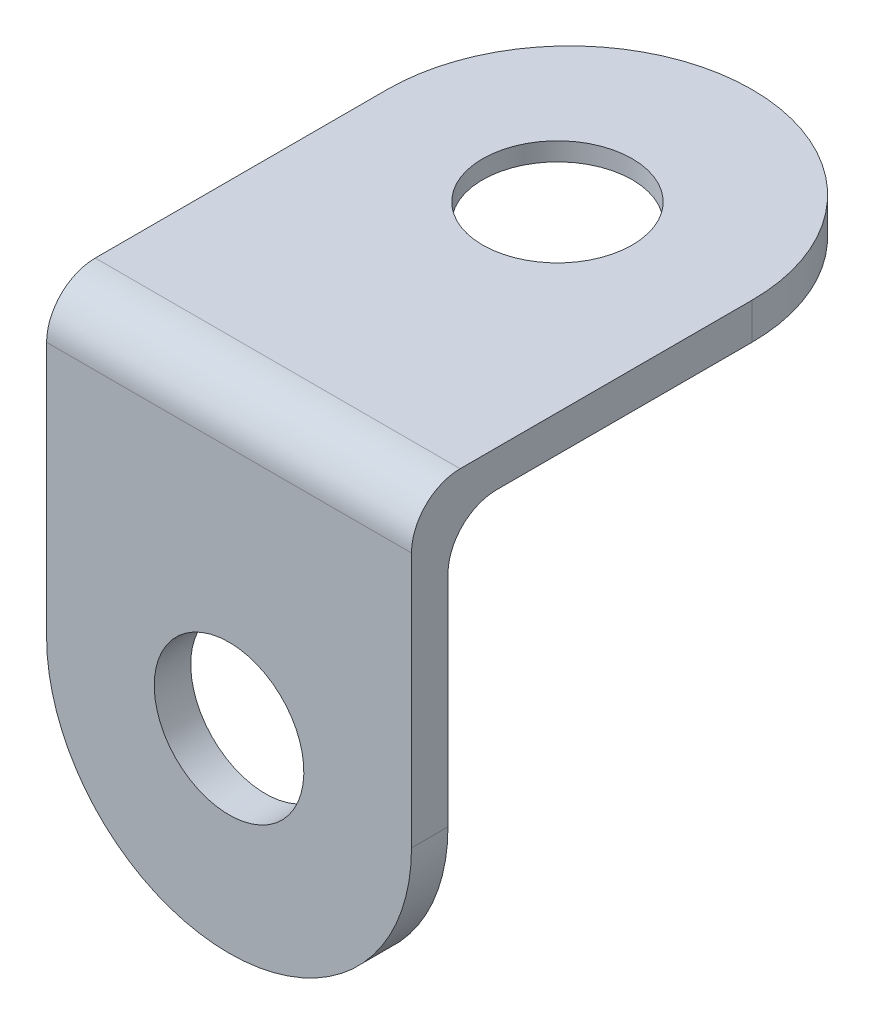
ISO-10303-21;
HEADER;
FILE_DESCRIPTION(('STEP AP214'),'2;1');
FILE_NAME('part.step','',(''),(''),'','','');
FILE_SCHEMA(('AUTOMOTIVE_DESIGN { 1 0 10303 214 1 1 1 1 }'));
ENDSEC;
DATA;
#1=APPLICATION_CONTEXT('core data for automotive mechanical design processes');
#2=APPLICATION_PROTOCOL_DEFINITION('international standard','automotive_design',2000,#1);
#3=PRODUCT_CONTEXT('',#1,'mechanical');
#4=PRODUCT('Part','Part','',(#3));
#5=PRODUCT_RELATED_PRODUCT_CATEGORY('part','',(#4));
#6=PRODUCT_DEFINITION_FORMATION('','',#4);
#7=PRODUCT_DEFINITION_CONTEXT('part definition',#1,'design');
#8=PRODUCT_DEFINITION('design','',#6,#7);
#9=PRODUCT_DEFINITION_SHAPE('','',#8);
#10=(LENGTH_UNIT() NAMED_UNIT(*) SI_UNIT(.MILLI.,.METRE.));
#11=(NAMED_UNIT(*) PLANE_ANGLE_UNIT() SI_UNIT($,.RADIAN.));
#12=(NAMED_UNIT(*) SI_UNIT($,.STERADIAN.) SOLID_ANGLE_UNIT());
#13=UNCERTAINTY_MEASURE_WITH_UNIT(LENGTH_MEASURE(1.E-05),#10,'distance_accuracy_value','');
#14=(GEOMETRIC_REPRESENTATION_CONTEXT(3) GLOBAL_UNCERTAINTY_ASSIGNED_CONTEXT((#13)) GLOBAL_UNIT_ASSIGNED_CONTEXT((#10,
#11,#12)) REPRESENTATION_CONTEXT('',''));
#15=CARTESIAN_POINT('',(0.,0.,0.));
#16=DIRECTION('',(0.,0.,1.));
#17=DIRECTION('',(1.,0.,0.));
#18=AXIS2_PLACEMENT_3D('',#15,#16,#17);
#19=CARTESIAN_POINT('',(0.,1.5,-12.));
#20=DIRECTION('',(0.,-1.,0.));
#21=DIRECTION('',(0.,0.,-1.));
#22=AXIS2_PLACEMENT_3D('',#19,#20,#21);
#23=CYLINDRICAL_SURFACE('',#22,3.075);
#24=CARTESIAN_POINT('',(0.,1.5,-12.));
#25=DIRECTION('',(0.,1.,0.));
#26=DIRECTION('',(0.,0.,1.));
#27=AXIS2_PLACEMENT_3D('',#24,#25,#26);
#28=CIRCLE('',#27,3.075);
#29=CARTESIAN_POINT('',(0.,1.5,-8.925));
#30=VERTEX_POINT('',#29);
#31=EDGE_CURVE('E127',#30,#30,#28,.T.);
#32=ORIENTED_EDGE('',*,*,#31,.T.);
#33=EDGE_LOOP('',(#32));
#34=FACE_BOUND('',#33,.T.);
#35=CARTESIAN_POINT('',(0.,0.75,-12.));
#36=DIRECTION('',(0.,-1.,0.));
#37=DIRECTION('',(0.,0.,-1.));
#38=AXIS2_PLACEMENT_3D('',#35,#36,#37);
#39=CIRCLE('',#38,3.075);
#40=CARTESIAN_POINT('',(0.,0.75,-15.075));
#41=VERTEX_POINT('',#40);
#42=EDGE_CURVE('E219',#41,#41,#39,.T.);
#43=ORIENTED_EDGE('',*,*,#42,.T.);
#44=EDGE_LOOP('',(#43));
#45=FACE_BOUND('',#44,.T.);
#46=ADVANCED_FACE('F38',(#34,#45),#23,.F.);
#47=CARTESIAN_POINT('',(0.,1.5,-12.5));
#48=DIRECTION('',(0.,1.,0.));
#49=DIRECTION('',(0.,0.,1.));
#50=AXIS2_PLACEMENT_3D('',#47,#48,#49);
#51=PLANE('',#50);
#52=DIRECTION('',(0.,0.,1.));
#53=VECTOR('',#52,1.);
#54=CARTESIAN_POINT('',(-7.5,1.5,0.));
#55=LINE('',#54,#53);
#56=CARTESIAN_POINT('',(-7.5,1.5,-12.5));
#57=VERTEX_POINT('',#56);
#58=CARTESIAN_POINT('',(-7.5,1.5,-0.499999999999994));
#59=VERTEX_POINT('',#58);
#60=EDGE_CURVE('E140',#57,#59,#55,.T.);
#61=ORIENTED_EDGE('',*,*,#60,.T.);
#62=DIRECTION('',(1.,0.,0.));
#63=VECTOR('',#62,1.);
#64=CARTESIAN_POINT('',(7.5,1.5,-0.499999999999994));
#65=LINE('',#64,#63);
#66=CARTESIAN_POINT('',(7.5,1.5,-0.499999999999994));
#67=VERTEX_POINT('',#66);
#68=EDGE_CURVE('E157',#59,#67,#65,.T.);
#69=ORIENTED_EDGE('',*,*,#68,.T.);
#70=DIRECTION('',(0.,0.,-1.));
#71=VECTOR('',#70,1.);
#72=CARTESIAN_POINT('',(7.5,1.5,0.));
#73=LINE('',#72,#71);
#74=CARTESIAN_POINT('',(7.5,1.5,-12.5));
#75=VERTEX_POINT('',#74);
#76=EDGE_CURVE('E135',#67,#75,#73,.T.);
#77=ORIENTED_EDGE('',*,*,#76,.T.);
#78=CARTESIAN_POINT('',(0.,1.5,-12.5));
#79=DIRECTION('',(0.,1.,0.));
#80=DIRECTION('',(0.,0.,1.));
#81=AXIS2_PLACEMENT_3D('',#78,#79,#80);
#82=CIRCLE('',#81,7.5);
#83=EDGE_CURVE('E137',#75,#57,#82,.T.);
#84=ORIENTED_EDGE('',*,*,#83,.T.);
#85=EDGE_LOOP('',(#61,#69,#77,#84));
#86=FACE_BOUND('',#85,.T.);
#87=ORIENTED_EDGE('',*,*,#31,.F.);
#88=EDGE_LOOP('',(#87));
#89=FACE_BOUND('',#88,.T.);
#90=ADVANCED_FACE('F185',(#86,#89),#51,.T.);
#91=CARTESIAN_POINT('',(0.,0.,-12.5));
#92=DIRECTION('',(0.,1.,0.));
#93=DIRECTION('',(0.,0.,1.));
#94=AXIS2_PLACEMENT_3D('',#91,#92,#93);
#95=PLANE('',#94);
#96=CARTESIAN_POINT('',(0.,0.,-12.));
#97=DIRECTION('',(0.,1.,0.));
#98=DIRECTION('',(0.,0.,1.));
#99=AXIS2_PLACEMENT_3D('',#96,#97,#98);
#100=CIRCLE('',#99,4.37403810567666);
#101=CARTESIAN_POINT('',(0.,0.,-7.62596189432334));
#102=VERTEX_POINT('',#101);
#103=EDGE_CURVE('E216',#102,#102,#100,.T.);
#104=ORIENTED_EDGE('',*,*,#103,.T.);
#105=EDGE_LOOP('',(#104));
#106=FACE_BOUND('',#105,.T.);
#107=DIRECTION('',(0.,0.,-1.));
#108=VECTOR('',#107,1.);
#109=CARTESIAN_POINT('',(7.5,0.,0.));
#110=LINE('',#109,#108);
#111=CARTESIAN_POINT('',(7.5,0.,-1.99999999999999));
#112=VERTEX_POINT('',#111);
#113=CARTESIAN_POINT('',(7.5,0.,-12.5));
#114=VERTEX_POINT('',#113);
#115=EDGE_CURVE('E130',#112,#114,#110,.T.);
#116=ORIENTED_EDGE('',*,*,#115,.F.);
#117=DIRECTION('',(1.,0.,0.));
#118=VECTOR('',#117,1.);
#119=CARTESIAN_POINT('',(0.,0.,-1.99999999999999));
#120=LINE('',#119,#118);
#121=CARTESIAN_POINT('',(-7.5,0.,-1.99999999999999));
#122=VERTEX_POINT('',#121);
#123=EDGE_CURVE('E155',#112,#122,#120,.F.);
#124=ORIENTED_EDGE('',*,*,#123,.T.);
#125=DIRECTION('',(0.,0.,1.));
#126=VECTOR('',#125,1.);
#127=CARTESIAN_POINT('',(-7.5,0.,0.));
#128=LINE('',#127,#126);
#129=CARTESIAN_POINT('',(-7.5,0.,-12.5));
#130=VERTEX_POINT('',#129);
#131=EDGE_CURVE('E138',#130,#122,#128,.T.);
#132=ORIENTED_EDGE('',*,*,#131,.F.);
#133=CARTESIAN_POINT('',(0.,0.,-12.5));
#134=DIRECTION('',(0.,1.,0.));
#135=DIRECTION('',(0.,0.,1.));
#136=AXIS2_PLACEMENT_3D('',#133,#134,#135);
#137=CIRCLE('',#136,7.5);
#138=EDGE_CURVE('E145',#114,#130,#137,.T.);
#139=ORIENTED_EDGE('',*,*,#138,.F.);
#140=EDGE_LOOP('',(#116,#124,#132,#139));
#141=FACE_BOUND('',#140,.T.);
#142=ADVANCED_FACE('F169',(#106,#141),#95,.F.);
#143=CARTESIAN_POINT('',(7.5,1.5,0.));
#144=DIRECTION('',(-1.,0.,0.));
#145=DIRECTION('',(0.,0.,1.));
#146=AXIS2_PLACEMENT_3D('',#143,#144,#145);
#147=PLANE('',#146);
#148=ORIENTED_EDGE('',*,*,#76,.F.);
#149=CARTESIAN_POINT('',(7.5,-0.5,-0.499999999999994));
#150=DIRECTION('',(-1.,0.,0.));
#151=DIRECTION('',(0.,0.,1.));
#152=AXIS2_PLACEMENT_3D('',#149,#150,#151);
#153=CIRCLE('',#152,2.);
#154=CARTESIAN_POINT('',(7.5,-0.499999999999993,1.50000000000001));
#155=VERTEX_POINT('',#154);
#156=EDGE_CURVE('E61',#67,#155,#153,.F.);
#157=ORIENTED_EDGE('',*,*,#156,.T.);
#158=DIRECTION('',(0.,-1.,0.));
#159=VECTOR('',#158,1.);
#160=CARTESIAN_POINT('',(7.5,1.50000000000001,1.5));
#161=LINE('',#160,#159);
#162=CARTESIAN_POINT('',(7.5,-11.,1.50000000000004));
#163=VERTEX_POINT('',#162);
#164=EDGE_CURVE('E125',#155,#163,#161,.T.);
#165=ORIENTED_EDGE('',*,*,#164,.T.);
#166=DIRECTION('',(0.,0.,1.));
#167=VECTOR('',#166,1.);
#168=CARTESIAN_POINT('',(7.5,-11.,0.));
#169=LINE('',#168,#167);
#170=CARTESIAN_POINT('',(7.5,-11.,0.));
#171=VERTEX_POINT('',#170);
#172=EDGE_CURVE('E118',#171,#163,#169,.T.);
#173=ORIENTED_EDGE('',*,*,#172,.F.);
#174=DIRECTION('',(0.,-1.,0.));
#175=VECTOR('',#174,1.);
#176=CARTESIAN_POINT('',(7.5,1.5,0.));
#177=LINE('',#176,#175);
#178=CARTESIAN_POINT('',(7.5,-1.99999999999999,0.));
#179=VERTEX_POINT('',#178);
#180=EDGE_CURVE('E103',#179,#171,#177,.T.);
#181=ORIENTED_EDGE('',*,*,#180,.F.);
#182=CARTESIAN_POINT('',(7.5,-2.,-1.99999999999999));
#183=DIRECTION('',(-1.,0.,0.));
#184=DIRECTION('',(0.,0.,1.));
#185=AXIS2_PLACEMENT_3D('',#182,#183,#184);
#186=CIRCLE('',#185,2.);
#187=EDGE_CURVE('E46',#179,#112,#186,.T.);
#188=ORIENTED_EDGE('',*,*,#187,.T.);
#189=ORIENTED_EDGE('',*,*,#115,.T.);
#190=DIRECTION('',(0.,-1.,0.));
#191=VECTOR('',#190,1.);
#192=CARTESIAN_POINT('',(7.5,1.5,-12.5));
#193=LINE('',#192,#191);
#194=EDGE_CURVE('E151',#75,#114,#193,.T.);
#195=ORIENTED_EDGE('',*,*,#194,.F.);
#196=EDGE_LOOP('',(#148,#157,#165,#173,#181,#188,#189,#195));
#197=FACE_BOUND('',#196,.T.);
#198=ADVANCED_FACE('F124',(#197),#147,.F.);
#199=CARTESIAN_POINT('',(0.,1.5,-12.5));
#200=DIRECTION('',(0.,-1.,0.));
#201=DIRECTION('',(0.,0.,-1.));
#202=AXIS2_PLACEMENT_3D('',#199,#200,#201);
#203=CYLINDRICAL_SURFACE('',#202,7.5);
#204=ORIENTED_EDGE('',*,*,#138,.T.);
#205=DIRECTION('',(0.,-1.,0.));
#206=VECTOR('',#205,1.);
#207=CARTESIAN_POINT('',(-7.5,1.5,-12.5));
#208=LINE('',#207,#206);
#209=EDGE_CURVE('E143',#57,#130,#208,.T.);
#210=ORIENTED_EDGE('',*,*,#209,.F.);
#211=ORIENTED_EDGE('',*,*,#83,.F.);
#212=ORIENTED_EDGE('',*,*,#194,.T.);
#213=EDGE_LOOP('',(#204,#210,#211,#212));
#214=FACE_BOUND('',#213,.T.);
#215=ADVANCED_FACE('F189',(#214),#203,.T.);
#216=CARTESIAN_POINT('',(-7.5,1.5,0.));
#217=DIRECTION('',(1.,0.,0.));
#218=DIRECTION('',(0.,0.,-1.));
#219=AXIS2_PLACEMENT_3D('',#216,#217,#218);
#220=PLANE('',#219);
#221=DIRECTION('',(0.,1.,0.));
#222=VECTOR('',#221,1.);
#223=CARTESIAN_POINT('',(-7.5,1.50000000000001,1.5));
#224=LINE('',#223,#222);
#225=CARTESIAN_POINT('',(-7.5,-11.,1.50000000000004));
#226=VERTEX_POINT('',#225);
#227=CARTESIAN_POINT('',(-7.5,-0.499999999999993,1.50000000000001));
#228=VERTEX_POINT('',#227);
#229=EDGE_CURVE('E113',#226,#228,#224,.T.);
#230=ORIENTED_EDGE('',*,*,#229,.T.);
#231=CARTESIAN_POINT('',(-7.5,-0.5,-0.499999999999994));
#232=DIRECTION('',(1.,0.,0.));
#233=DIRECTION('',(0.,0.,-1.));
#234=AXIS2_PLACEMENT_3D('',#231,#232,#233);
#235=CIRCLE('',#234,2.);
#236=EDGE_CURVE('E162',#228,#59,#235,.F.);
#237=ORIENTED_EDGE('',*,*,#236,.T.);
#238=ORIENTED_EDGE('',*,*,#60,.F.);
#239=ORIENTED_EDGE('',*,*,#209,.T.);
#240=ORIENTED_EDGE('',*,*,#131,.T.);
#241=CARTESIAN_POINT('',(-7.5,-2.,-1.99999999999999));
#242=DIRECTION('',(1.,0.,0.));
#243=DIRECTION('',(0.,0.,-1.));
#244=AXIS2_PLACEMENT_3D('',#241,#242,#243);
#245=CIRCLE('',#244,2.);
#246=CARTESIAN_POINT('',(-7.5,-1.99999999999999,0.));
#247=VERTEX_POINT('',#246);
#248=EDGE_CURVE('E11',#122,#247,#245,.T.);
#249=ORIENTED_EDGE('',*,*,#248,.T.);
#250=DIRECTION('',(0.,1.,0.));
#251=VECTOR('',#250,1.);
#252=CARTESIAN_POINT('',(-7.5,1.5,0.));
#253=LINE('',#252,#251);
#254=CARTESIAN_POINT('',(-7.5,-11.,0.));
#255=VERTEX_POINT('',#254);
#256=EDGE_CURVE('E122',#255,#247,#253,.T.);
#257=ORIENTED_EDGE('',*,*,#256,.F.);
#258=DIRECTION('',(0.,0.,1.));
#259=VECTOR('',#258,1.);
#260=CARTESIAN_POINT('',(-7.5,-11.,0.));
#261=LINE('',#260,#259);
#262=EDGE_CURVE('E120',#255,#226,#261,.T.);
#263=ORIENTED_EDGE('',*,*,#262,.T.);
#264=EDGE_LOOP('',(#230,#237,#238,#239,#240,#249,#257,#263));
#265=FACE_BOUND('',#264,.T.);
#266=ADVANCED_FACE('F174',(#265),#220,.F.);
#267=CARTESIAN_POINT('',(0.,-11.,0.));
#268=DIRECTION('',(0.,0.,-1.));
#269=DIRECTION('',(0.,1.,0.));
#270=AXIS2_PLACEMENT_3D('',#267,#268,#269);
#271=PLANE('',#270);
#272=ORIENTED_EDGE('',*,*,#256,.T.);
#273=DIRECTION('',(1.,0.,0.));
#274=VECTOR('',#273,1.);
#275=CARTESIAN_POINT('',(0.,-1.99999999999999,0.));
#276=LINE('',#275,#274);
#277=EDGE_CURVE('E111',#247,#179,#276,.T.);
#278=ORIENTED_EDGE('',*,*,#277,.T.);
#279=ORIENTED_EDGE('',*,*,#180,.T.);
#280=CARTESIAN_POINT('',(0.,-11.,0.));
#281=DIRECTION('',(0.,0.,-1.));
#282=DIRECTION('',(0.,1.,0.));
#283=AXIS2_PLACEMENT_3D('',#280,#281,#282);
#284=CIRCLE('',#283,7.5);
#285=EDGE_CURVE('E108',#171,#255,#284,.T.);
#286=ORIENTED_EDGE('',*,*,#285,.T.);
#287=EDGE_LOOP('',(#272,#278,#279,#286));
#288=FACE_BOUND('',#287,.T.);
#289=CARTESIAN_POINT('',(0.,-10.5,0.));
#290=DIRECTION('',(0.,0.,-1.));
#291=DIRECTION('',(0.,1.,0.));
#292=AXIS2_PLACEMENT_3D('',#289,#290,#291);
#293=CIRCLE('',#292,3.075);
#294=CARTESIAN_POINT('',(0.,-7.425,0.));
#295=VERTEX_POINT('',#294);
#296=EDGE_CURVE('E179',#295,#295,#293,.T.);
#297=ORIENTED_EDGE('',*,*,#296,.F.);
#298=EDGE_LOOP('',(#297));
#299=FACE_BOUND('',#298,.T.);
#300=ADVANCED_FACE('F106',(#288,#299),#271,.T.);
#301=CARTESIAN_POINT('',(0.,-11.,1.50000000000004));
#302=DIRECTION('',(0.,0.,-1.));
#303=DIRECTION('',(0.,1.,0.));
#304=AXIS2_PLACEMENT_3D('',#301,#302,#303);
#305=PLANE('',#304);
#306=ORIENTED_EDGE('',*,*,#164,.F.);
#307=DIRECTION('',(1.,0.,0.));
#308=VECTOR('',#307,1.);
#309=CARTESIAN_POINT('',(-7.5,-0.499999999999993,1.50000000000001));
#310=LINE('',#309,#308);
#311=EDGE_CURVE('E53',#155,#228,#310,.F.);
#312=ORIENTED_EDGE('',*,*,#311,.T.);
#313=ORIENTED_EDGE('',*,*,#229,.F.);
#314=CARTESIAN_POINT('',(0.,-11.,1.50000000000004));
#315=DIRECTION('',(0.,0.,-1.));
#316=DIRECTION('',(0.,1.,0.));
#317=AXIS2_PLACEMENT_3D('',#314,#315,#316);
#318=CIRCLE('',#317,7.5);
#319=EDGE_CURVE('E178',#163,#226,#318,.T.);
#320=ORIENTED_EDGE('',*,*,#319,.F.);
#321=EDGE_LOOP('',(#306,#312,#313,#320));
#322=FACE_BOUND('',#321,.T.);
#323=CARTESIAN_POINT('',(0.,-10.5,1.50000000000004));
#324=DIRECTION('',(0.,0.,-1.));
#325=DIRECTION('',(0.,1.,0.));
#326=AXIS2_PLACEMENT_3D('',#323,#324,#325);
#327=CIRCLE('',#326,3.075);
#328=CARTESIAN_POINT('',(0.,-7.425,1.50000000000003));
#329=VERTEX_POINT('',#328);
#330=EDGE_CURVE('E218',#329,#329,#327,.T.);
#331=ORIENTED_EDGE('',*,*,#330,.T.);
#332=EDGE_LOOP('',(#331));
#333=FACE_BOUND('',#332,.T.);
#334=ADVANCED_FACE('F232',(#322,#333),#305,.F.);
#335=CARTESIAN_POINT('',(0.,-11.,0.));
#336=DIRECTION('',(0.,0.,1.));
#337=DIRECTION('',(0.,-1.,0.));
#338=AXIS2_PLACEMENT_3D('',#335,#336,#337);
#339=CYLINDRICAL_SURFACE('',#338,7.5);
#340=ORIENTED_EDGE('',*,*,#319,.T.);
#341=ORIENTED_EDGE('',*,*,#262,.F.);
#342=ORIENTED_EDGE('',*,*,#285,.F.);
#343=ORIENTED_EDGE('',*,*,#172,.T.);
#344=EDGE_LOOP('',(#340,#341,#342,#343));
#345=FACE_BOUND('',#344,.T.);
#346=ADVANCED_FACE('F117',(#345),#339,.T.);
#347=CARTESIAN_POINT('',(0.,-10.5,0.));
#348=DIRECTION('',(0.,0.,1.));
#349=DIRECTION('',(0.,-1.,0.));
#350=AXIS2_PLACEMENT_3D('',#347,#348,#349);
#351=CYLINDRICAL_SURFACE('',#350,3.075);
#352=ORIENTED_EDGE('',*,*,#296,.T.);
#353=EDGE_LOOP('',(#352));
#354=FACE_BOUND('',#353,.T.);
#355=ORIENTED_EDGE('',*,*,#330,.F.);
#356=EDGE_LOOP('',(#355));
#357=FACE_BOUND('',#356,.T.);
#358=ADVANCED_FACE('F229',(#354,#357),#351,.F.);
#359=CARTESIAN_POINT('',(0.,-2.,-1.99999999999999));
#360=DIRECTION('',(1.,0.,0.));
#361=DIRECTION('',(0.,0.,-1.));
#362=AXIS2_PLACEMENT_3D('',#359,#360,#361);
#363=CYLINDRICAL_SURFACE('',#362,2.);
#364=ORIENTED_EDGE('',*,*,#248,.F.);
#365=ORIENTED_EDGE('',*,*,#123,.F.);
#366=ORIENTED_EDGE('',*,*,#187,.F.);
#367=ORIENTED_EDGE('',*,*,#277,.F.);
#368=EDGE_LOOP('',(#364,#365,#366,#367));
#369=FACE_BOUND('',#368,.T.);
#370=ADVANCED_FACE('F172',(#369),#363,.F.);
#371=CARTESIAN_POINT('',(0.,-0.5,-0.499999999999994));
#372=DIRECTION('',(-1.,0.,0.));
#373=DIRECTION('',(0.,0.,1.));
#374=AXIS2_PLACEMENT_3D('',#371,#372,#373);
#375=CYLINDRICAL_SURFACE('',#374,2.);
#376=ORIENTED_EDGE('',*,*,#236,.F.);
#377=ORIENTED_EDGE('',*,*,#311,.F.);
#378=ORIENTED_EDGE('',*,*,#156,.F.);
#379=ORIENTED_EDGE('',*,*,#68,.F.);
#380=EDGE_LOOP('',(#376,#377,#378,#379));
#381=FACE_BOUND('',#380,.T.);
#382=ADVANCED_FACE('F40',(#381),#375,.T.);
#383=CARTESIAN_POINT('',(0.,0.75,-12.));
#384=DIRECTION('',(0.,-1.,0.));
#385=DIRECTION('',(0.,0.,-1.));
#386=AXIS2_PLACEMENT_3D('',#383,#384,#385);
#387=CONICAL_SURFACE('',#386,3.075,1.0471975511966);
#388=ORIENTED_EDGE('',*,*,#103,.F.);
#389=EDGE_LOOP('',(#388));
#390=FACE_BOUND('',#389,.T.);
#391=ORIENTED_EDGE('',*,*,#42,.F.);
#392=EDGE_LOOP('',(#391));
#393=FACE_BOUND('',#392,.T.);
#394=ADVANCED_FACE('F240',(#390,#393),#387,.F.);
#395=CLOSED_SHELL('',(#46,#90,#142,#198,#215,#266,#300,#334,#346,#358,#370,#382,#394));
#396=MANIFOLD_SOLID_BREP('B2',#395);
#397=ADVANCED_BREP_SHAPE_REPRESENTATION('',(#18,#396),#14);
#398=SHAPE_DEFINITION_REPRESENTATION(#9,#397);
ENDSEC;
END-ISO-10303-21;
